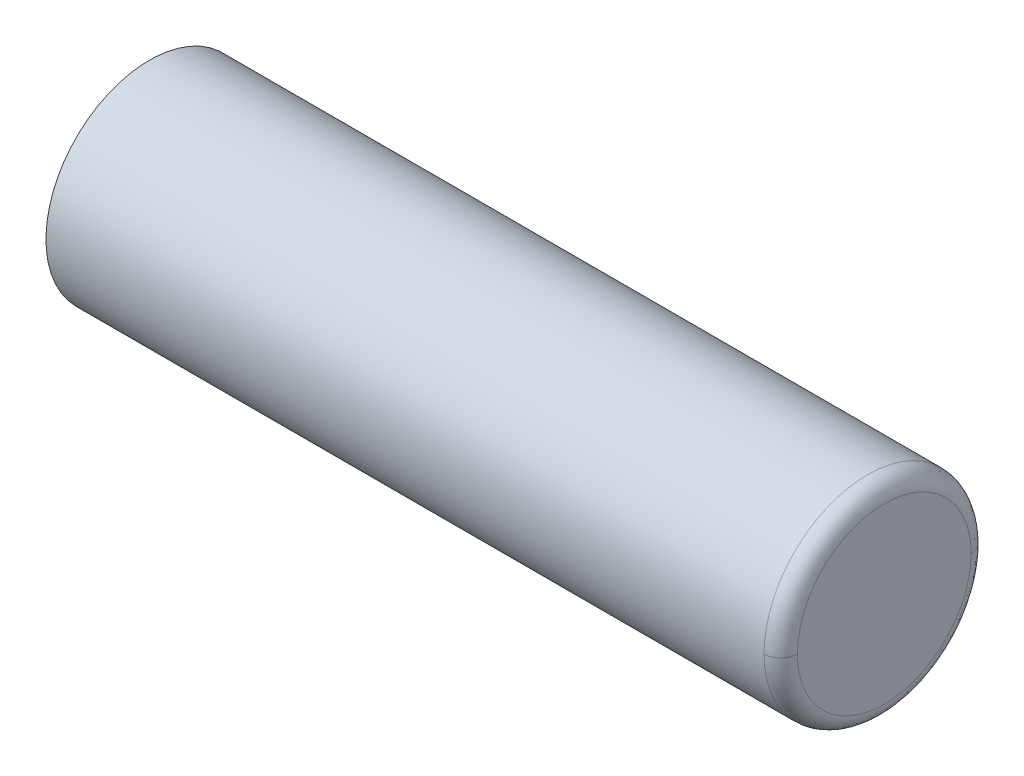
ISO-10303-21;
HEADER;
FILE_DESCRIPTION(('STEP AP214'),'2;1');
FILE_NAME('part.step','',(''),(''),'','','');
FILE_SCHEMA(('AUTOMOTIVE_DESIGN { 1 0 10303 214 1 1 1 1 }'));
ENDSEC;
DATA;
#1=APPLICATION_CONTEXT('core data for automotive mechanical design processes');
#2=APPLICATION_PROTOCOL_DEFINITION('international standard','automotive_design',2000,#1);
#3=PRODUCT_CONTEXT('',#1,'mechanical');
#4=PRODUCT('Part','Part','',(#3));
#5=PRODUCT_RELATED_PRODUCT_CATEGORY('part','',(#4));
#6=PRODUCT_DEFINITION_FORMATION('','',#4);
#7=PRODUCT_DEFINITION_CONTEXT('part definition',#1,'design');
#8=PRODUCT_DEFINITION('design','',#6,#7);
#9=PRODUCT_DEFINITION_SHAPE('','',#8);
#10=(LENGTH_UNIT() NAMED_UNIT(*) SI_UNIT(.MILLI.,.METRE.));
#11=(NAMED_UNIT(*) PLANE_ANGLE_UNIT() SI_UNIT($,.RADIAN.));
#12=(NAMED_UNIT(*) SI_UNIT($,.STERADIAN.) SOLID_ANGLE_UNIT());
#13=UNCERTAINTY_MEASURE_WITH_UNIT(LENGTH_MEASURE(1.E-05),#10,'distance_accuracy_value','');
#14=(GEOMETRIC_REPRESENTATION_CONTEXT(3) GLOBAL_UNCERTAINTY_ASSIGNED_CONTEXT((#13)) GLOBAL_UNIT_ASSIGNED_CONTEXT((#10,
#11,#12)) REPRESENTATION_CONTEXT('',''));
#15=CARTESIAN_POINT('',(0.,0.,0.));
#16=DIRECTION('',(0.,0.,1.));
#17=DIRECTION('',(1.,0.,0.));
#18=AXIS2_PLACEMENT_3D('',#15,#16,#17);
#19=CARTESIAN_POINT('',(10.4500832908,0.,-3.0975020854));
#20=CARTESIAN_POINT('',(10.4500832908,-6.1950041708,-3.0975020854));
#21=CARTESIAN_POINT('',(10.4500832908,-6.1950041708,3.0975020854));
#22=CARTESIAN_POINT('',(10.4500832908,0.,3.0975020854));
#23=CARTESIAN_POINT('',(10.7900268832,0.,-3.1316102214));
#24=CARTESIAN_POINT('',(10.7900268832,-6.2632204174,-3.1316102214));
#25=CARTESIAN_POINT('',(10.7900268832,-6.2632204174,3.1316102214));
#26=CARTESIAN_POINT('',(10.7900268832,0.,3.1316102214));
#27=CARTESIAN_POINT('',(11.0316102202,0.,-2.8900268844));
#28=CARTESIAN_POINT('',(11.0316102202,-5.7800537688,-2.8900268844));
#29=CARTESIAN_POINT('',(11.0316102202,-5.7800537688,2.8900268844));
#30=CARTESIAN_POINT('',(11.0316102202,0.,2.8900268844));
#31=CARTESIAN_POINT('',(10.9975020842,0.,-2.550083292));
#32=CARTESIAN_POINT('',(10.9975020842,-5.100166584,-2.550083292));
#33=CARTESIAN_POINT('',(10.9975020842,-5.100166584,2.550083292));
#34=CARTESIAN_POINT('',(10.9975020842,0.,2.550083292));
#35=(BOUNDED_SURFACE() B_SPLINE_SURFACE(3,3,((#19,#20,#21,#22),(#23,#24,#25,#26),(#27,#28,#29,
#30),(#31,#32,#33,#34)),.UNSPECIFIED.,.F.,.F.,.F.) B_SPLINE_SURFACE_WITH_KNOTS((4,4),(4,4),(0.,
1.),(0.,1.),.UNSPECIFIED.) GEOMETRIC_REPRESENTATION_ITEM() RATIONAL_B_SPLINE_SURFACE(((1.,
0.333333333333333,0.333333333333333,1.),(0.755320871117971,0.25177362370599,0.25177362370599,
0.755320871117971),(0.755320871117971,0.25177362370599,0.25177362370599,0.755320871117971),(1.,
0.333333333333333,0.333333333333333,1.))) REPRESENTATION_ITEM('') SURFACE());
#36=CARTESIAN_POINT('',(10.4500832908,0.,3.0975020854));
#37=CARTESIAN_POINT('',(10.7900268832,0.,3.1316102214));
#38=CARTESIAN_POINT('',(11.0316102202,0.,2.8900268844));
#39=CARTESIAN_POINT('',(10.9975020842,0.,2.550083292));
#40=(BOUNDED_CURVE() B_SPLINE_CURVE(3,(#36,#37,#38,#39),.UNSPECIFIED.,.F.,
.F.) B_SPLINE_CURVE_WITH_KNOTS((4,4),(0.,1.),
.UNSPECIFIED.) CURVE() GEOMETRIC_REPRESENTATION_ITEM() RATIONAL_B_SPLINE_CURVE((1.,
0.755320871117971,0.755320871117971,1.)) REPRESENTATION_ITEM(''));
#41=CARTESIAN_POINT('',(11.0000000000642,0.,2.59999999818914));
#42=VERTEX_POINT('',#41);
#43=CARTESIAN_POINT('',(10.5000000019464,0.,3.10000000065347));
#44=VERTEX_POINT('',#43);
#45=EDGE_CURVE('E35',#42,#44,#40,.F.);
#46=CARTESIAN_POINT('',(10.5000000058,0.,0.));
#47=DIRECTION('',(-1.,0.,0.));
#48=DIRECTION('',(0.,0.,1.));
#49=AXIS2_PLACEMENT_3D('',#46,#47,#48);
#50=CIRCLE('',#49,3.0999999976);
#51=CARTESIAN_POINT('',(10.5000000023317,-7.94775785116452E-10,-3.10000000065347));
#52=VERTEX_POINT('',#51);
#53=EDGE_CURVE('E47',#44,#52,#50,.F.);
#54=CARTESIAN_POINT('',(10.4500832908,0.,-3.0975020854));
#55=CARTESIAN_POINT('',(10.7900268832,0.,-3.1316102214));
#56=CARTESIAN_POINT('',(11.0316102202,0.,-2.8900268844));
#57=CARTESIAN_POINT('',(10.9975020842,0.,-2.550083292));
#58=(BOUNDED_CURVE() B_SPLINE_CURVE(3,(#54,#55,#56,#57),.UNSPECIFIED.,.F.,
.F.) B_SPLINE_CURVE_WITH_KNOTS((4,4),(0.,1.),
.UNSPECIFIED.) CURVE() GEOMETRIC_REPRESENTATION_ITEM() RATIONAL_B_SPLINE_CURVE((1.,
0.755320871117971,0.755320871117971,1.)) REPRESENTATION_ITEM(''));
#59=CARTESIAN_POINT('',(11.0000000000642,0.,-2.59999999818914));
#60=VERTEX_POINT('',#59);
#61=EDGE_CURVE('E42',#52,#60,#58,.T.);
#62=CARTESIAN_POINT('',(11.000000002507,0.,-2.60000000089082));
#63=CARTESIAN_POINT('',(11.0000000025069,-5.2000000015569,-2.60000000089082));
#64=CARTESIAN_POINT('',(11.0000000025069,-5.2000000015569,2.60000000089082));
#65=CARTESIAN_POINT('',(11.000000002507,0.,2.60000000089082));
#66=(BOUNDED_CURVE() B_SPLINE_CURVE(3,(#62,#63,#64,#65),.UNSPECIFIED.,.F.,
.F.) B_SPLINE_CURVE_WITH_KNOTS((4,4),(0.,1.),
.UNSPECIFIED.) CURVE() GEOMETRIC_REPRESENTATION_ITEM() RATIONAL_B_SPLINE_CURVE((0.956578302121113,
0.318859434040371,0.318859434040371,0.956578302121113)) REPRESENTATION_ITEM(''));
#67=EDGE_CURVE('E44',#60,#42,#66,.T.);
#68=ORIENTED_EDGE('',*,*,#45,.T.);
#69=ORIENTED_EDGE('',*,*,#53,.T.);
#70=ORIENTED_EDGE('',*,*,#61,.T.);
#71=ORIENTED_EDGE('',*,*,#67,.T.);
#72=EDGE_LOOP('',(#68,#69,#70,#71));
#73=FACE_BOUND('',#72,.T.);
#74=ADVANCED_FACE('F16',(#73),#35,.T.);
#75=CARTESIAN_POINT('',(-10.9999999964,-3.1371999994,3.1371999994));
#76=DIRECTION('',(1.,0.,0.));
#77=DIRECTION('',(0.,0.,-1.));
#78=AXIS2_PLACEMENT_3D('',#75,#76,#77);
#79=PLANE('',#78);
#80=CARTESIAN_POINT('',(-10.9999999964,0.,0.));
#81=DIRECTION('',(-1.,0.,0.));
#82=DIRECTION('',(0.,-1.,0.));
#83=AXIS2_PLACEMENT_3D('',#80,#81,#82);
#84=CIRCLE('',#83,3.0999999976);
#85=CARTESIAN_POINT('',(-10.9999999964,-3.09999999760001,0.));
#86=VERTEX_POINT('',#85);
#87=EDGE_CURVE('E21',#86,#86,#84,.T.);
#88=ORIENTED_EDGE('',*,*,#87,.T.);
#89=EDGE_LOOP('',(#88));
#90=FACE_BOUND('',#89,.T.);
#91=ADVANCED_FACE('F88',(#90),#79,.F.);
#92=CARTESIAN_POINT('',(10.9999999964,-2.6311999954,-2.6311999954));
#93=DIRECTION('',(-1.,0.,0.));
#94=DIRECTION('',(0.,0.,1.));
#95=AXIS2_PLACEMENT_3D('',#92,#93,#94);
#96=PLANE('',#95);
#97=ORIENTED_EDGE('',*,*,#67,.F.);
#98=CARTESIAN_POINT('',(11.0000000025069,0.,2.60000000089082));
#99=CARTESIAN_POINT('',(11.000000002507,5.2000000015569,2.60000000089082));
#100=CARTESIAN_POINT('',(11.000000002507,5.2000000015569,-2.60000000089082));
#101=CARTESIAN_POINT('',(11.0000000025069,0.,-2.60000000089082));
#102=(BOUNDED_CURVE() B_SPLINE_CURVE(3,(#98,#99,#100,#101),.UNSPECIFIED.,.F.,
.F.) B_SPLINE_CURVE_WITH_KNOTS((4,4),(0.,1.),
.UNSPECIFIED.) CURVE() GEOMETRIC_REPRESENTATION_ITEM() RATIONAL_B_SPLINE_CURVE((0.956578302121113,
0.31885943404037,0.31885943404037,0.956578302121113)) REPRESENTATION_ITEM(''));
#103=EDGE_CURVE('E27',#42,#60,#102,.T.);
#104=ORIENTED_EDGE('',*,*,#103,.F.);
#105=EDGE_LOOP('',(#97,#104));
#106=FACE_BOUND('',#105,.T.);
#107=ADVANCED_FACE('F18',(#106),#96,.F.);
#108=CARTESIAN_POINT('',(10.5000000058,0.,0.));
#109=DIRECTION('',(-1.,0.,0.));
#110=DIRECTION('',(0.,-1.,0.));
#111=AXIS2_PLACEMENT_3D('',#108,#109,#110);
#112=CYLINDRICAL_SURFACE('',#111,3.0999999976);
#113=ORIENTED_EDGE('',*,*,#87,.F.);
#114=EDGE_LOOP('',(#113));
#115=FACE_BOUND('',#114,.T.);
#116=CARTESIAN_POINT('',(10.4999999996342,0.,0.));
#117=DIRECTION('',(1.,0.,0.));
#118=DIRECTION('',(0.,0.,-1.));
#119=AXIS2_PLACEMENT_3D('',#116,#117,#118);
#120=CIRCLE('',#119,3.10000000370695);
#121=EDGE_CURVE('E10',#52,#44,#120,.T.);
#122=ORIENTED_EDGE('',*,*,#121,.F.);
#123=ORIENTED_EDGE('',*,*,#53,.F.);
#124=EDGE_LOOP('',(#122,#123));
#125=FACE_BOUND('',#124,.T.);
#126=ADVANCED_FACE('F75',(#115,#125),#112,.T.);
#127=CARTESIAN_POINT('',(10.4500832908,0.,3.0975020854));
#128=CARTESIAN_POINT('',(10.4500832908,6.1950041708,3.0975020854));
#129=CARTESIAN_POINT('',(10.4500832908,6.1950041708,-3.0975020854));
#130=CARTESIAN_POINT('',(10.4500832908,0.,-3.0975020854));
#131=CARTESIAN_POINT('',(10.7900268832,0.,3.1316102214));
#132=CARTESIAN_POINT('',(10.7900268832,6.2632204174,3.1316102214));
#133=CARTESIAN_POINT('',(10.7900268832,6.2632204174,-3.1316102214));
#134=CARTESIAN_POINT('',(10.7900268832,0.,-3.1316102214));
#135=CARTESIAN_POINT('',(11.0316102202,0.,2.8900268844));
#136=CARTESIAN_POINT('',(11.0316102202,5.7800537688,2.8900268844));
#137=CARTESIAN_POINT('',(11.0316102202,5.7800537688,-2.8900268844));
#138=CARTESIAN_POINT('',(11.0316102202,0.,-2.8900268844));
#139=CARTESIAN_POINT('',(10.9975020842,0.,2.550083292));
#140=CARTESIAN_POINT('',(10.9975020842,5.100166584,2.550083292));
#141=CARTESIAN_POINT('',(10.9975020842,5.100166584,-2.550083292));
#142=CARTESIAN_POINT('',(10.9975020842,0.,-2.550083292));
#143=(BOUNDED_SURFACE() B_SPLINE_SURFACE(3,3,((#127,#128,#129,#130),(#131,#132,#133,#134),(#135,
#136,#137,#138),(#139,#140,#141,#142)),.UNSPECIFIED.,.F.,.F.,
.F.) B_SPLINE_SURFACE_WITH_KNOTS((4,4),(4,4),(0.,1.),(0.,1.),
.UNSPECIFIED.) GEOMETRIC_REPRESENTATION_ITEM() RATIONAL_B_SPLINE_SURFACE(((1.,0.333333333333333,
0.333333333333333,1.),(0.755320871117971,0.25177362370599,0.25177362370599,0.755320871117971),
(0.755320871117971,0.25177362370599,0.25177362370599,0.755320871117971),(1.,0.333333333333333,
0.333333333333333,1.))) REPRESENTATION_ITEM('') SURFACE());
#144=ORIENTED_EDGE('',*,*,#121,.T.);
#145=ORIENTED_EDGE('',*,*,#45,.F.);
#146=ORIENTED_EDGE('',*,*,#103,.T.);
#147=ORIENTED_EDGE('',*,*,#61,.F.);
#148=EDGE_LOOP('',(#144,#145,#146,#147));
#149=FACE_BOUND('',#148,.T.);
#150=ADVANCED_FACE('F58',(#149),#143,.T.);
#151=CLOSED_SHELL('',(#74,#91,#107,#126,#150));
#152=MANIFOLD_SOLID_BREP('B1',#151);
#153=ADVANCED_BREP_SHAPE_REPRESENTATION('',(#18,#152),#14);
#154=SHAPE_DEFINITION_REPRESENTATION(#9,#153);
ENDSEC;
END-ISO-10303-21;
